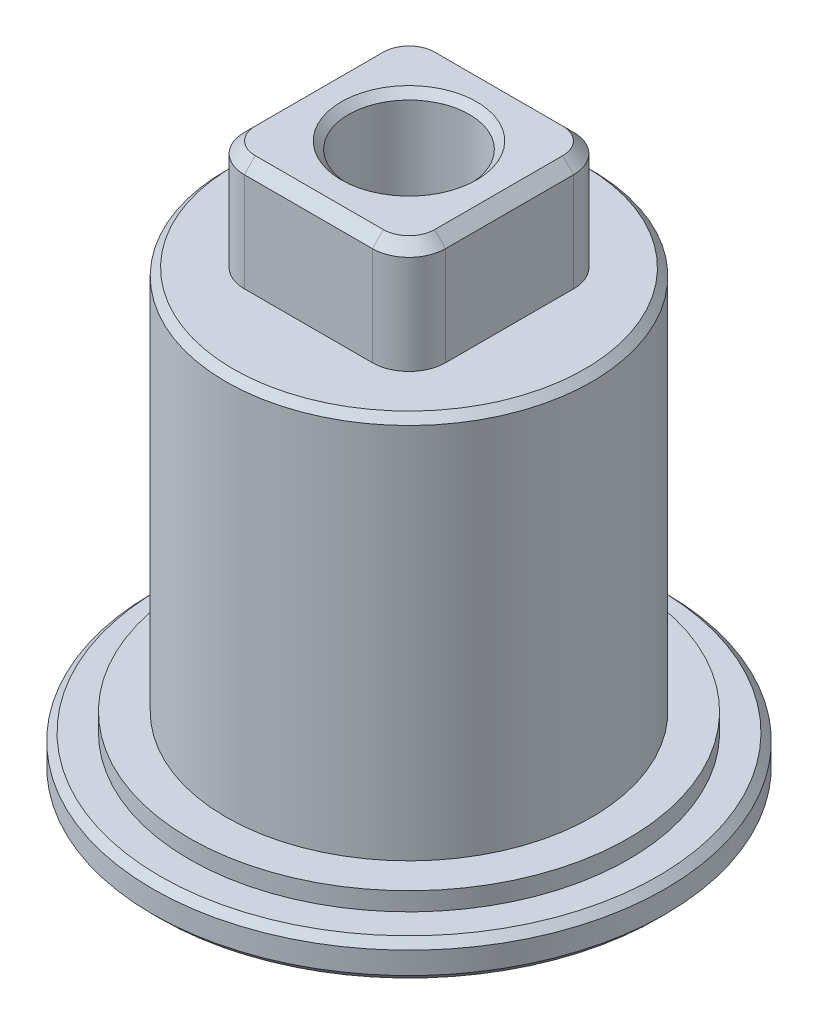
ISO-10303-21;
HEADER;
FILE_DESCRIPTION(('STEP AP214'),'2;1');
FILE_NAME('part.step','',(''),(''),'','','');
FILE_SCHEMA(('AUTOMOTIVE_DESIGN { 1 0 10303 214 1 1 1 1 }'));
ENDSEC;
DATA;
#1=APPLICATION_CONTEXT('core data for automotive mechanical design processes');
#2=APPLICATION_PROTOCOL_DEFINITION('international standard','automotive_design',2000,#1);
#3=PRODUCT_CONTEXT('',#1,'mechanical');
#4=PRODUCT('Part','Part','',(#3));
#5=PRODUCT_RELATED_PRODUCT_CATEGORY('part','',(#4));
#6=PRODUCT_DEFINITION_FORMATION('','',#4);
#7=PRODUCT_DEFINITION_CONTEXT('part definition',#1,'design');
#8=PRODUCT_DEFINITION('design','',#6,#7);
#9=PRODUCT_DEFINITION_SHAPE('','',#8);
#10=(LENGTH_UNIT() NAMED_UNIT(*) SI_UNIT(.MILLI.,.METRE.));
#11=(NAMED_UNIT(*) PLANE_ANGLE_UNIT() SI_UNIT($,.RADIAN.));
#12=(NAMED_UNIT(*) SI_UNIT($,.STERADIAN.) SOLID_ANGLE_UNIT());
#13=UNCERTAINTY_MEASURE_WITH_UNIT(LENGTH_MEASURE(1.E-05),#10,'distance_accuracy_value','');
#14=(GEOMETRIC_REPRESENTATION_CONTEXT(3) GLOBAL_UNCERTAINTY_ASSIGNED_CONTEXT((#13)) GLOBAL_UNIT_ASSIGNED_CONTEXT((#10,
#11,#12)) REPRESENTATION_CONTEXT('',''));
#15=CARTESIAN_POINT('',(0.,0.,0.));
#16=DIRECTION('',(0.,0.,1.));
#17=DIRECTION('',(1.,0.,0.));
#18=AXIS2_PLACEMENT_3D('',#15,#16,#17);
#19=CARTESIAN_POINT('',(0.,12.,0.));
#20=DIRECTION('',(0.,1.,0.));
#21=DIRECTION('',(0.,0.,1.));
#22=AXIS2_PLACEMENT_3D('',#19,#20,#21);
#23=PLANE('',#22);
#24=CARTESIAN_POINT('',(0.,12.,0.));
#25=DIRECTION('',(0.,1.,0.));
#26=DIRECTION('',(0.,0.,1.));
#27=AXIS2_PLACEMENT_3D('',#24,#25,#26);
#28=CIRCLE('',#27,4.80000000000001);
#29=CARTESIAN_POINT('',(0.,12.,4.80000000000001));
#30=VERTEX_POINT('',#29);
#31=EDGE_CURVE('E243',#30,#30,#28,.T.);
#32=ORIENTED_EDGE('',*,*,#31,.T.);
#33=EDGE_LOOP('',(#32));
#34=FACE_BOUND('',#33,.T.);
#35=DIRECTION('',(-1.,0.,0.));
#36=VECTOR('',#35,1.);
#37=CARTESIAN_POINT('',(0.,12.,-2.75));
#38=LINE('',#37,#36);
#39=CARTESIAN_POINT('',(1.75,12.,-2.75));
#40=VERTEX_POINT('',#39);
#41=CARTESIAN_POINT('',(-1.75,12.,-2.75));
#42=VERTEX_POINT('',#41);
#43=EDGE_CURVE('E354',#40,#42,#38,.T.);
#44=ORIENTED_EDGE('',*,*,#43,.F.);
#45=CARTESIAN_POINT('',(1.75,12.,-1.75));
#46=DIRECTION('',(0.,1.,0.));
#47=DIRECTION('',(0.,0.,1.));
#48=AXIS2_PLACEMENT_3D('',#45,#46,#47);
#49=CIRCLE('',#48,1.);
#50=CARTESIAN_POINT('',(2.75,12.,-1.75));
#51=VERTEX_POINT('',#50);
#52=EDGE_CURVE('E231',#40,#51,#49,.F.);
#53=ORIENTED_EDGE('',*,*,#52,.T.);
#54=DIRECTION('',(0.,0.,1.));
#55=VECTOR('',#54,1.);
#56=CARTESIAN_POINT('',(2.75,12.,0.));
#57=LINE('',#56,#55);
#58=CARTESIAN_POINT('',(2.75,12.,1.75));
#59=VERTEX_POINT('',#58);
#60=EDGE_CURVE('E356',#51,#59,#57,.T.);
#61=ORIENTED_EDGE('',*,*,#60,.T.);
#62=CARTESIAN_POINT('',(1.75,12.,1.75));
#63=DIRECTION('',(0.,1.,0.));
#64=DIRECTION('',(0.,0.,1.));
#65=AXIS2_PLACEMENT_3D('',#62,#63,#64);
#66=CIRCLE('',#65,1.);
#67=CARTESIAN_POINT('',(1.75,12.,2.75));
#68=VERTEX_POINT('',#67);
#69=EDGE_CURVE('E229',#59,#68,#66,.F.);
#70=ORIENTED_EDGE('',*,*,#69,.T.);
#71=DIRECTION('',(-1.,0.,0.));
#72=VECTOR('',#71,1.);
#73=CARTESIAN_POINT('',(0.,12.,2.75));
#74=LINE('',#73,#72);
#75=CARTESIAN_POINT('',(-1.75,12.,2.75));
#76=VERTEX_POINT('',#75);
#77=EDGE_CURVE('E201',#68,#76,#74,.T.);
#78=ORIENTED_EDGE('',*,*,#77,.T.);
#79=CARTESIAN_POINT('',(-1.75,12.,1.75));
#80=DIRECTION('',(0.,1.,0.));
#81=DIRECTION('',(0.,0.,1.));
#82=AXIS2_PLACEMENT_3D('',#79,#80,#81);
#83=CIRCLE('',#82,1.);
#84=CARTESIAN_POINT('',(-2.75,12.,1.75));
#85=VERTEX_POINT('',#84);
#86=EDGE_CURVE('E235',#76,#85,#83,.F.);
#87=ORIENTED_EDGE('',*,*,#86,.T.);
#88=DIRECTION('',(0.,0.,1.));
#89=VECTOR('',#88,1.);
#90=CARTESIAN_POINT('',(-2.75,12.,0.));
#91=LINE('',#90,#89);
#92=CARTESIAN_POINT('',(-2.75,12.,-1.75));
#93=VERTEX_POINT('',#92);
#94=EDGE_CURVE('E349',#93,#85,#91,.T.);
#95=ORIENTED_EDGE('',*,*,#94,.F.);
#96=CARTESIAN_POINT('',(-1.75,12.,-1.75));
#97=DIRECTION('',(0.,1.,0.));
#98=DIRECTION('',(0.,0.,1.));
#99=AXIS2_PLACEMENT_3D('',#96,#97,#98);
#100=CIRCLE('',#99,1.);
#101=EDGE_CURVE('E233',#93,#42,#100,.F.);
#102=ORIENTED_EDGE('',*,*,#101,.T.);
#103=EDGE_LOOP('',(#44,#53,#61,#70,#78,#87,#95,#102));
#104=FACE_BOUND('',#103,.T.);
#105=ADVANCED_FACE('F43',(#34,#104),#23,.T.);
#106=CARTESIAN_POINT('',(0.,1.5,0.));
#107=DIRECTION('',(0.,1.,0.));
#108=DIRECTION('',(0.,0.,1.));
#109=AXIS2_PLACEMENT_3D('',#106,#107,#108);
#110=PLANE('',#109);
#111=CARTESIAN_POINT('',(0.,1.5,0.));
#112=DIRECTION('',(0.,1.,0.));
#113=DIRECTION('',(0.,0.,1.));
#114=AXIS2_PLACEMENT_3D('',#111,#112,#113);
#115=CIRCLE('',#114,6.);
#116=CARTESIAN_POINT('',(0.,1.5,6.));
#117=VERTEX_POINT('',#116);
#118=EDGE_CURVE('E343',#117,#117,#115,.T.);
#119=ORIENTED_EDGE('',*,*,#118,.T.);
#120=EDGE_LOOP('',(#119));
#121=FACE_BOUND('',#120,.T.);
#122=CARTESIAN_POINT('',(0.,1.5,0.));
#123=DIRECTION('',(0.,1.,0.));
#124=DIRECTION('',(0.,0.,1.));
#125=AXIS2_PLACEMENT_3D('',#122,#123,#124);
#126=CIRCLE('',#125,5.);
#127=CARTESIAN_POINT('',(0.,1.5,5.));
#128=VERTEX_POINT('',#127);
#129=EDGE_CURVE('E337',#128,#128,#126,.F.);
#130=ORIENTED_EDGE('',*,*,#129,.T.);
#131=EDGE_LOOP('',(#130));
#132=FACE_BOUND('',#131,.T.);
#133=ADVANCED_FACE('F417',(#121,#132),#110,.T.);
#134=CARTESIAN_POINT('',(0.,1.,0.));
#135=DIRECTION('',(0.,1.,0.));
#136=DIRECTION('',(0.,0.,1.));
#137=AXIS2_PLACEMENT_3D('',#134,#135,#136);
#138=PLANE('',#137);
#139=CARTESIAN_POINT('',(0.,1.,0.));
#140=DIRECTION('',(0.,1.,0.));
#141=DIRECTION('',(0.,0.,1.));
#142=AXIS2_PLACEMENT_3D('',#139,#140,#141);
#143=CIRCLE('',#142,6.8);
#144=CARTESIAN_POINT('',(0.,1.,6.8));
#145=VERTEX_POINT('',#144);
#146=EDGE_CURVE('E249',#145,#145,#143,.T.);
#147=ORIENTED_EDGE('',*,*,#146,.T.);
#148=EDGE_LOOP('',(#147));
#149=FACE_BOUND('',#148,.T.);
#150=CARTESIAN_POINT('',(0.,1.,0.));
#151=DIRECTION('',(0.,1.,0.));
#152=DIRECTION('',(0.,0.,1.));
#153=AXIS2_PLACEMENT_3D('',#150,#151,#152);
#154=CIRCLE('',#153,6.);
#155=CARTESIAN_POINT('',(0.,1.,6.));
#156=VERTEX_POINT('',#155);
#157=EDGE_CURVE('E346',#156,#156,#154,.F.);
#158=ORIENTED_EDGE('',*,*,#157,.T.);
#159=EDGE_LOOP('',(#158));
#160=FACE_BOUND('',#159,.T.);
#161=ADVANCED_FACE('F423',(#149,#160),#138,.T.);
#162=CARTESIAN_POINT('',(0.,1.,0.));
#163=DIRECTION('',(0.,-1.,0.));
#164=DIRECTION('',(0.,0.,-1.));
#165=AXIS2_PLACEMENT_3D('',#162,#163,#164);
#166=CYLINDRICAL_SURFACE('',#165,7.);
#167=CARTESIAN_POINT('',(0.,0.799999999999994,0.));
#168=DIRECTION('',(0.,1.,0.));
#169=DIRECTION('',(0.,0.,1.));
#170=AXIS2_PLACEMENT_3D('',#167,#168,#169);
#171=CIRCLE('',#170,7.);
#172=CARTESIAN_POINT('',(0.,0.799999999999994,7.));
#173=VERTEX_POINT('',#172);
#174=EDGE_CURVE('E255',#173,#173,#171,.F.);
#175=ORIENTED_EDGE('',*,*,#174,.T.);
#176=EDGE_LOOP('',(#175));
#177=FACE_BOUND('',#176,.T.);
#178=CARTESIAN_POINT('',(0.,0.199999999999998,0.));
#179=DIRECTION('',(0.,1.,0.));
#180=DIRECTION('',(0.,0.,1.));
#181=AXIS2_PLACEMENT_3D('',#178,#179,#180);
#182=CIRCLE('',#181,7.);
#183=CARTESIAN_POINT('',(0.,0.199999999999998,7.));
#184=VERTEX_POINT('',#183);
#185=EDGE_CURVE('E252',#184,#184,#182,.T.);
#186=ORIENTED_EDGE('',*,*,#185,.T.);
#187=EDGE_LOOP('',(#186));
#188=FACE_BOUND('',#187,.T.);
#189=ADVANCED_FACE('F440',(#177,#188),#166,.T.);
#190=CARTESIAN_POINT('',(0.,1.,0.));
#191=DIRECTION('',(0.,-1.,0.));
#192=DIRECTION('',(0.,0.,-1.));
#193=AXIS2_PLACEMENT_3D('',#190,#191,#192);
#194=CYLINDRICAL_SURFACE('',#193,1.65);
#195=CARTESIAN_POINT('',(0.,14.8,0.));
#196=DIRECTION('',(0.,1.,0.));
#197=DIRECTION('',(0.,0.,1.));
#198=AXIS2_PLACEMENT_3D('',#195,#196,#197);
#199=CIRCLE('',#198,1.65);
#200=CARTESIAN_POINT('',(0.,14.8,1.65));
#201=VERTEX_POINT('',#200);
#202=EDGE_CURVE('E237',#201,#201,#199,.T.);
#203=ORIENTED_EDGE('',*,*,#202,.T.);
#204=EDGE_LOOP('',(#203));
#205=FACE_BOUND('',#204,.T.);
#206=CARTESIAN_POINT('',(0.,2.,0.));
#207=DIRECTION('',(0.,1.,0.));
#208=DIRECTION('',(0.,0.,1.));
#209=AXIS2_PLACEMENT_3D('',#206,#207,#208);
#210=CIRCLE('',#209,1.65);
#211=CARTESIAN_POINT('',(1.,2.,1.31244047484067));
#212=VERTEX_POINT('',#211);
#213=CARTESIAN_POINT('',(1.,2.,-1.31244047484067));
#214=VERTEX_POINT('',#213);
#215=EDGE_CURVE('E177',#212,#214,#210,.T.);
#216=ORIENTED_EDGE('',*,*,#215,.F.);
#217=CARTESIAN_POINT('',(-1.,2.,1.31244047484067));
#218=VERTEX_POINT('',#217);
#219=EDGE_CURVE('E195',#218,#212,#210,.T.);
#220=ORIENTED_EDGE('',*,*,#219,.F.);
#221=CARTESIAN_POINT('',(-1.,2.,-1.31244047484067));
#222=VERTEX_POINT('',#221);
#223=EDGE_CURVE('E200',#222,#218,#210,.T.);
#224=ORIENTED_EDGE('',*,*,#223,.F.);
#225=EDGE_CURVE('E206',#214,#222,#210,.T.);
#226=ORIENTED_EDGE('',*,*,#225,.F.);
#227=EDGE_LOOP('',(#216,#220,#224,#226));
#228=FACE_BOUND('',#227,.T.);
#229=ADVANCED_FACE('F204',(#205,#228),#194,.F.);
#230=CARTESIAN_POINT('',(0.,0.,0.));
#231=DIRECTION('',(0.,1.,0.));
#232=DIRECTION('',(0.,0.,1.));
#233=AXIS2_PLACEMENT_3D('',#230,#231,#232);
#234=PLANE('',#233);
#235=CARTESIAN_POINT('',(0.,0.,0.));
#236=DIRECTION('',(0.,1.,0.));
#237=DIRECTION('',(0.,0.,1.));
#238=AXIS2_PLACEMENT_3D('',#235,#236,#237);
#239=CIRCLE('',#238,6.8);
#240=CARTESIAN_POINT('',(0.,0.,6.8));
#241=VERTEX_POINT('',#240);
#242=EDGE_CURVE('E258',#241,#241,#239,.F.);
#243=ORIENTED_EDGE('',*,*,#242,.T.);
#244=EDGE_LOOP('',(#243));
#245=FACE_BOUND('',#244,.T.);
#246=DIRECTION('',(0.,0.,1.));
#247=VECTOR('',#246,1.);
#248=CARTESIAN_POINT('',(1.,0.,0.));
#249=LINE('',#248,#247);
#250=CARTESIAN_POINT('',(1.,0.,-3.));
#251=VERTEX_POINT('',#250);
#252=CARTESIAN_POINT('',(1.,0.,3.));
#253=VERTEX_POINT('',#252);
#254=EDGE_CURVE('E319',#251,#253,#249,.T.);
#255=ORIENTED_EDGE('',*,*,#254,.F.);
#256=CARTESIAN_POINT('',(0.,0.,-3.));
#257=DIRECTION('',(0.,-1.,0.));
#258=DIRECTION('',(0.,0.,-1.));
#259=AXIS2_PLACEMENT_3D('',#256,#257,#258);
#260=CIRCLE('',#259,1.);
#261=CARTESIAN_POINT('',(-1.,0.,-3.));
#262=VERTEX_POINT('',#261);
#263=EDGE_CURVE('E314',#262,#251,#260,.T.);
#264=ORIENTED_EDGE('',*,*,#263,.F.);
#265=DIRECTION('',(0.,0.,1.));
#266=VECTOR('',#265,1.);
#267=CARTESIAN_POINT('',(-1.,0.,0.));
#268=LINE('',#267,#266);
#269=CARTESIAN_POINT('',(-1.,0.,3.));
#270=VERTEX_POINT('',#269);
#271=EDGE_CURVE('E332',#262,#270,#268,.T.);
#272=ORIENTED_EDGE('',*,*,#271,.T.);
#273=CARTESIAN_POINT('',(0.,0.,3.));
#274=DIRECTION('',(0.,-1.,0.));
#275=DIRECTION('',(0.,0.,-1.));
#276=AXIS2_PLACEMENT_3D('',#273,#274,#275);
#277=CIRCLE('',#276,1.);
#278=EDGE_CURVE('E324',#253,#270,#277,.T.);
#279=ORIENTED_EDGE('',*,*,#278,.F.);
#280=EDGE_LOOP('',(#255,#264,#272,#279));
#281=FACE_BOUND('',#280,.T.);
#282=ADVANCED_FACE('F436',(#245,#281),#234,.F.);
#283=CARTESIAN_POINT('',(0.,1.5,0.));
#284=DIRECTION('',(0.,-1.,0.));
#285=DIRECTION('',(0.,0.,-1.));
#286=AXIS2_PLACEMENT_3D('',#283,#284,#285);
#287=CYLINDRICAL_SURFACE('',#286,6.);
#288=ORIENTED_EDGE('',*,*,#157,.F.);
#289=EDGE_LOOP('',(#288));
#290=FACE_BOUND('',#289,.T.);
#291=ORIENTED_EDGE('',*,*,#118,.F.);
#292=EDGE_LOOP('',(#291));
#293=FACE_BOUND('',#292,.T.);
#294=ADVANCED_FACE('F431',(#290,#293),#287,.T.);
#295=CARTESIAN_POINT('',(0.,12.,0.));
#296=DIRECTION('',(0.,-1.,0.));
#297=DIRECTION('',(0.,0.,-1.));
#298=AXIS2_PLACEMENT_3D('',#295,#296,#297);
#299=CYLINDRICAL_SURFACE('',#298,5.);
#300=CARTESIAN_POINT('',(0.,11.8,0.));
#301=DIRECTION('',(0.,1.,0.));
#302=DIRECTION('',(0.,0.,1.));
#303=AXIS2_PLACEMENT_3D('',#300,#301,#302);
#304=CIRCLE('',#303,5.);
#305=CARTESIAN_POINT('',(0.,11.8,5.));
#306=VERTEX_POINT('',#305);
#307=EDGE_CURVE('E246',#306,#306,#304,.F.);
#308=ORIENTED_EDGE('',*,*,#307,.T.);
#309=EDGE_LOOP('',(#308));
#310=FACE_BOUND('',#309,.T.);
#311=ORIENTED_EDGE('',*,*,#129,.F.);
#312=EDGE_LOOP('',(#311));
#313=FACE_BOUND('',#312,.T.);
#314=ADVANCED_FACE('F429',(#310,#313),#299,.T.);
#315=CARTESIAN_POINT('',(0.,15.,2.75));
#316=DIRECTION('',(0.,0.,-1.));
#317=DIRECTION('',(-1.,0.,0.));
#318=AXIS2_PLACEMENT_3D('',#315,#316,#317);
#319=PLANE('',#318);
#320=DIRECTION('',(0.,-1.,0.));
#321=VECTOR('',#320,1.);
#322=CARTESIAN_POINT('',(1.75,15.,2.75));
#323=LINE('',#322,#321);
#324=CARTESIAN_POINT('',(1.75,14.7,2.75));
#325=VERTEX_POINT('',#324);
#326=EDGE_CURVE('E217',#68,#325,#323,.F.);
#327=ORIENTED_EDGE('',*,*,#326,.T.);
#328=DIRECTION('',(-1.,0.,0.));
#329=VECTOR('',#328,1.);
#330=CARTESIAN_POINT('',(-1.75,14.7,2.75));
#331=LINE('',#330,#329);
#332=CARTESIAN_POINT('',(-1.75,14.7,2.75));
#333=VERTEX_POINT('',#332);
#334=EDGE_CURVE('E281',#325,#333,#331,.T.);
#335=ORIENTED_EDGE('',*,*,#334,.T.);
#336=DIRECTION('',(0.,-1.,0.));
#337=VECTOR('',#336,1.);
#338=CARTESIAN_POINT('',(-1.75,12.,2.75));
#339=LINE('',#338,#337);
#340=EDGE_CURVE('E215',#333,#76,#339,.T.);
#341=ORIENTED_EDGE('',*,*,#340,.T.);
#342=ORIENTED_EDGE('',*,*,#77,.F.);
#343=EDGE_LOOP('',(#327,#335,#341,#342));
#344=FACE_BOUND('',#343,.T.);
#345=ADVANCED_FACE('F368',(#344),#319,.F.);
#346=CARTESIAN_POINT('',(2.75,15.,0.));
#347=DIRECTION('',(-1.,0.,0.));
#348=DIRECTION('',(0.,0.,1.));
#349=AXIS2_PLACEMENT_3D('',#346,#347,#348);
#350=PLANE('',#349);
#351=DIRECTION('',(0.,-1.,0.));
#352=VECTOR('',#351,1.);
#353=CARTESIAN_POINT('',(2.75,15.,-1.75));
#354=LINE('',#353,#352);
#355=CARTESIAN_POINT('',(2.75,14.7,-1.75));
#356=VERTEX_POINT('',#355);
#357=EDGE_CURVE('E207',#51,#356,#354,.F.);
#358=ORIENTED_EDGE('',*,*,#357,.T.);
#359=DIRECTION('',(0.,0.,1.));
#360=VECTOR('',#359,1.);
#361=CARTESIAN_POINT('',(2.75,14.7,1.75));
#362=LINE('',#361,#360);
#363=CARTESIAN_POINT('',(2.75,14.7,1.75));
#364=VERTEX_POINT('',#363);
#365=EDGE_CURVE('E278',#356,#364,#362,.T.);
#366=ORIENTED_EDGE('',*,*,#365,.T.);
#367=DIRECTION('',(0.,-1.,0.));
#368=VECTOR('',#367,1.);
#369=CARTESIAN_POINT('',(2.75,15.,1.75));
#370=LINE('',#369,#368);
#371=EDGE_CURVE('E209',#364,#59,#370,.T.);
#372=ORIENTED_EDGE('',*,*,#371,.T.);
#373=ORIENTED_EDGE('',*,*,#60,.F.);
#374=EDGE_LOOP('',(#358,#366,#372,#373));
#375=FACE_BOUND('',#374,.T.);
#376=ADVANCED_FACE('F383',(#375),#350,.F.);
#377=CARTESIAN_POINT('',(0.,15.,-2.75));
#378=DIRECTION('',(0.,0.,-1.));
#379=DIRECTION('',(-1.,0.,0.));
#380=AXIS2_PLACEMENT_3D('',#377,#378,#379);
#381=PLANE('',#380);
#382=DIRECTION('',(0.,-1.,0.));
#383=VECTOR('',#382,1.);
#384=CARTESIAN_POINT('',(-1.75,15.,-2.75));
#385=LINE('',#384,#383);
#386=CARTESIAN_POINT('',(-1.75,14.7,-2.75));
#387=VERTEX_POINT('',#386);
#388=EDGE_CURVE('E220',#42,#387,#385,.F.);
#389=ORIENTED_EDGE('',*,*,#388,.T.);
#390=DIRECTION('',(1.,0.,0.));
#391=VECTOR('',#390,1.);
#392=CARTESIAN_POINT('',(0.,14.7,-2.75));
#393=LINE('',#392,#391);
#394=CARTESIAN_POINT('',(1.75,14.7,-2.75));
#395=VERTEX_POINT('',#394);
#396=EDGE_CURVE('E58',#387,#395,#393,.T.);
#397=ORIENTED_EDGE('',*,*,#396,.T.);
#398=DIRECTION('',(0.,-1.,0.));
#399=VECTOR('',#398,1.);
#400=CARTESIAN_POINT('',(1.75,12.,-2.75));
#401=LINE('',#400,#399);
#402=EDGE_CURVE('E222',#395,#40,#401,.T.);
#403=ORIENTED_EDGE('',*,*,#402,.T.);
#404=ORIENTED_EDGE('',*,*,#43,.T.);
#405=EDGE_LOOP('',(#389,#397,#403,#404));
#406=FACE_BOUND('',#405,.T.);
#407=ADVANCED_FACE('F756',(#406),#381,.T.);
#408=CARTESIAN_POINT('',(-2.75,15.,0.));
#409=DIRECTION('',(-1.,0.,0.));
#410=DIRECTION('',(0.,0.,1.));
#411=AXIS2_PLACEMENT_3D('',#408,#409,#410);
#412=PLANE('',#411);
#413=DIRECTION('',(0.,-1.,0.));
#414=VECTOR('',#413,1.);
#415=CARTESIAN_POINT('',(-2.75,15.,1.75));
#416=LINE('',#415,#414);
#417=CARTESIAN_POINT('',(-2.75,14.7,1.75));
#418=VERTEX_POINT('',#417);
#419=EDGE_CURVE('E224',#85,#418,#416,.F.);
#420=ORIENTED_EDGE('',*,*,#419,.T.);
#421=DIRECTION('',(0.,0.,-1.));
#422=VECTOR('',#421,1.);
#423=CARTESIAN_POINT('',(-2.75,14.7,0.));
#424=LINE('',#423,#422);
#425=CARTESIAN_POINT('',(-2.75,14.7,-1.75));
#426=VERTEX_POINT('',#425);
#427=EDGE_CURVE('E283',#418,#426,#424,.T.);
#428=ORIENTED_EDGE('',*,*,#427,.T.);
#429=DIRECTION('',(0.,-1.,0.));
#430=VECTOR('',#429,1.);
#431=CARTESIAN_POINT('',(-2.75,15.,-1.75));
#432=LINE('',#431,#430);
#433=EDGE_CURVE('E227',#426,#93,#432,.T.);
#434=ORIENTED_EDGE('',*,*,#433,.T.);
#435=ORIENTED_EDGE('',*,*,#94,.T.);
#436=EDGE_LOOP('',(#420,#428,#434,#435));
#437=FACE_BOUND('',#436,.T.);
#438=ADVANCED_FACE('F762',(#437),#412,.T.);
#439=CARTESIAN_POINT('',(0.,15.,0.));
#440=DIRECTION('',(0.,1.,0.));
#441=DIRECTION('',(0.,0.,1.));
#442=AXIS2_PLACEMENT_3D('',#439,#440,#441);
#443=PLANE('',#442);
#444=CARTESIAN_POINT('',(-1.75,15.,1.75));
#445=DIRECTION('',(0.,1.,0.));
#446=DIRECTION('',(0.,0.,1.));
#447=AXIS2_PLACEMENT_3D('',#444,#445,#446);
#448=CIRCLE('',#447,0.700000000000002);
#449=CARTESIAN_POINT('',(-2.45000000000001,15.,1.75));
#450=VERTEX_POINT('',#449);
#451=CARTESIAN_POINT('',(-1.75,15.,2.45));
#452=VERTEX_POINT('',#451);
#453=EDGE_CURVE('E274',#450,#452,#448,.T.);
#454=ORIENTED_EDGE('',*,*,#453,.T.);
#455=DIRECTION('',(1.,0.,0.));
#456=VECTOR('',#455,1.);
#457=CARTESIAN_POINT('',(1.75,15.,2.45));
#458=LINE('',#457,#456);
#459=CARTESIAN_POINT('',(1.75,15.,2.45));
#460=VERTEX_POINT('',#459);
#461=EDGE_CURVE('E276',#452,#460,#458,.T.);
#462=ORIENTED_EDGE('',*,*,#461,.T.);
#463=CARTESIAN_POINT('',(1.75,15.,1.75));
#464=DIRECTION('',(0.,1.,0.));
#465=DIRECTION('',(0.,0.,1.));
#466=AXIS2_PLACEMENT_3D('',#463,#464,#465);
#467=CIRCLE('',#466,0.700000000000002);
#468=CARTESIAN_POINT('',(2.45,15.,1.75));
#469=VERTEX_POINT('',#468);
#470=EDGE_CURVE('E272',#460,#469,#467,.T.);
#471=ORIENTED_EDGE('',*,*,#470,.T.);
#472=DIRECTION('',(0.,0.,-1.));
#473=VECTOR('',#472,1.);
#474=CARTESIAN_POINT('',(2.45,15.,-1.75));
#475=LINE('',#474,#473);
#476=CARTESIAN_POINT('',(2.45,15.,-1.75));
#477=VERTEX_POINT('',#476);
#478=EDGE_CURVE('E269',#469,#477,#475,.T.);
#479=ORIENTED_EDGE('',*,*,#478,.T.);
#480=CARTESIAN_POINT('',(1.75,15.,-1.75));
#481=DIRECTION('',(0.,1.,0.));
#482=DIRECTION('',(0.,0.,1.));
#483=AXIS2_PLACEMENT_3D('',#480,#481,#482);
#484=CIRCLE('',#483,0.700000000000002);
#485=CARTESIAN_POINT('',(1.75,15.,-2.45));
#486=VERTEX_POINT('',#485);
#487=EDGE_CURVE('E263',#477,#486,#484,.T.);
#488=ORIENTED_EDGE('',*,*,#487,.T.);
#489=DIRECTION('',(-1.,0.,0.));
#490=VECTOR('',#489,1.);
#491=CARTESIAN_POINT('',(0.,15.,-2.45));
#492=LINE('',#491,#490);
#493=CARTESIAN_POINT('',(-1.75,15.,-2.45));
#494=VERTEX_POINT('',#493);
#495=EDGE_CURVE('E261',#486,#494,#492,.T.);
#496=ORIENTED_EDGE('',*,*,#495,.T.);
#497=CARTESIAN_POINT('',(-1.75,15.,-1.75));
#498=DIRECTION('',(0.,1.,0.));
#499=DIRECTION('',(0.,0.,1.));
#500=AXIS2_PLACEMENT_3D('',#497,#498,#499);
#501=CIRCLE('',#500,0.700000000000002);
#502=CARTESIAN_POINT('',(-2.45,15.,-1.75));
#503=VERTEX_POINT('',#502);
#504=EDGE_CURVE('E265',#494,#503,#501,.T.);
#505=ORIENTED_EDGE('',*,*,#504,.T.);
#506=DIRECTION('',(0.,0.,1.));
#507=VECTOR('',#506,1.);
#508=CARTESIAN_POINT('',(-2.45000000000001,15.,0.));
#509=LINE('',#508,#507);
#510=EDGE_CURVE('E267',#503,#450,#509,.T.);
#511=ORIENTED_EDGE('',*,*,#510,.T.);
#512=EDGE_LOOP('',(#454,#462,#471,#479,#488,#496,#505,#511));
#513=FACE_BOUND('',#512,.T.);
#514=CARTESIAN_POINT('',(0.,15.,0.));
#515=DIRECTION('',(0.,1.,0.));
#516=DIRECTION('',(0.,0.,1.));
#517=AXIS2_PLACEMENT_3D('',#514,#515,#516);
#518=CIRCLE('',#517,1.85);
#519=CARTESIAN_POINT('',(0.,15.,1.85));
#520=VERTEX_POINT('',#519);
#521=EDGE_CURVE('E240',#520,#520,#518,.F.);
#522=ORIENTED_EDGE('',*,*,#521,.T.);
#523=EDGE_LOOP('',(#522));
#524=FACE_BOUND('',#523,.T.);
#525=ADVANCED_FACE('F395',(#513,#524),#443,.T.);
#526=CARTESIAN_POINT('',(0.,2.,0.));
#527=DIRECTION('',(0.,-1.,0.));
#528=DIRECTION('',(0.,0.,-1.));
#529=AXIS2_PLACEMENT_3D('',#526,#527,#528);
#530=PLANE('',#529);
#531=ORIENTED_EDGE('',*,*,#225,.T.);
#532=DIRECTION('',(0.,0.,1.));
#533=VECTOR('',#532,1.);
#534=CARTESIAN_POINT('',(-1.,2.,0.));
#535=LINE('',#534,#533);
#536=CARTESIAN_POINT('',(-1.,2.,-3.));
#537=VERTEX_POINT('',#536);
#538=EDGE_CURVE('E327',#537,#222,#535,.T.);
#539=ORIENTED_EDGE('',*,*,#538,.F.);
#540=CARTESIAN_POINT('',(0.,2.,-3.));
#541=DIRECTION('',(0.,-1.,0.));
#542=DIRECTION('',(0.,0.,-1.));
#543=AXIS2_PLACEMENT_3D('',#540,#541,#542);
#544=CIRCLE('',#543,1.);
#545=CARTESIAN_POINT('',(1.,2.,-3.));
#546=VERTEX_POINT('',#545);
#547=EDGE_CURVE('E191',#537,#546,#544,.T.);
#548=ORIENTED_EDGE('',*,*,#547,.T.);
#549=DIRECTION('',(0.,0.,1.));
#550=VECTOR('',#549,1.);
#551=CARTESIAN_POINT('',(1.,2.,0.));
#552=LINE('',#551,#550);
#553=EDGE_CURVE('E190',#546,#214,#552,.T.);
#554=ORIENTED_EDGE('',*,*,#553,.T.);
#555=EDGE_LOOP('',(#531,#539,#548,#554));
#556=FACE_BOUND('',#555,.T.);
#557=ADVANCED_FACE('F711',(#556),#530,.T.);
#558=ORIENTED_EDGE('',*,*,#219,.T.);
#559=CARTESIAN_POINT('',(1.,2.,3.));
#560=VERTEX_POINT('',#559);
#561=EDGE_CURVE('E182',#212,#560,#552,.T.);
#562=ORIENTED_EDGE('',*,*,#561,.T.);
#563=CARTESIAN_POINT('',(0.,2.,3.));
#564=DIRECTION('',(0.,-1.,0.));
#565=DIRECTION('',(0.,0.,-1.));
#566=AXIS2_PLACEMENT_3D('',#563,#564,#565);
#567=CIRCLE('',#566,1.);
#568=CARTESIAN_POINT('',(-1.,2.,3.));
#569=VERTEX_POINT('',#568);
#570=EDGE_CURVE('E880',#560,#569,#567,.T.);
#571=ORIENTED_EDGE('',*,*,#570,.T.);
#572=EDGE_CURVE('E197',#218,#569,#535,.T.);
#573=ORIENTED_EDGE('',*,*,#572,.F.);
#574=EDGE_LOOP('',(#558,#562,#571,#573));
#575=FACE_BOUND('',#574,.T.);
#576=ADVANCED_FACE('F196',(#575),#530,.T.);
#577=CARTESIAN_POINT('',(0.,2.,-3.));
#578=DIRECTION('',(0.,-1.,0.));
#579=DIRECTION('',(0.,0.,-1.));
#580=AXIS2_PLACEMENT_3D('',#577,#578,#579);
#581=CYLINDRICAL_SURFACE('',#580,1.);
#582=ORIENTED_EDGE('',*,*,#263,.T.);
#583=DIRECTION('',(0.,-1.,0.));
#584=VECTOR('',#583,1.);
#585=CARTESIAN_POINT('',(1.,2.,-3.));
#586=LINE('',#585,#584);
#587=EDGE_CURVE('E341',#546,#251,#586,.T.);
#588=ORIENTED_EDGE('',*,*,#587,.F.);
#589=ORIENTED_EDGE('',*,*,#547,.F.);
#590=DIRECTION('',(0.,-1.,0.));
#591=VECTOR('',#590,1.);
#592=CARTESIAN_POINT('',(-1.,2.,-3.));
#593=LINE('',#592,#591);
#594=EDGE_CURVE('E335',#537,#262,#593,.T.);
#595=ORIENTED_EDGE('',*,*,#594,.T.);
#596=EDGE_LOOP('',(#582,#588,#589,#595));
#597=FACE_BOUND('',#596,.T.);
#598=ADVANCED_FACE('F691',(#597),#581,.F.);
#599=CARTESIAN_POINT('',(-1.,2.,0.));
#600=DIRECTION('',(1.,0.,0.));
#601=DIRECTION('',(0.,0.,-1.));
#602=AXIS2_PLACEMENT_3D('',#599,#600,#601);
#603=PLANE('',#602);
#604=CARTESIAN_POINT('',(-1.,3.43684841009068,5.02023073470829));
#605=CARTESIAN_POINT('',(-1.,3.3764677213073,4.87158273692043));
#606=CARTESIAN_POINT('',(-1.,3.316166733192,4.7229022272814));
#607=CARTESIAN_POINT('',(-1.,3.195794288905,4.42544087612442));
#608=CARTESIAN_POINT('',(-1.,3.13572284275206,4.27666003055317));
#609=CARTESIAN_POINT('',(-1.,3.01580466050986,3.97877636111956));
#610=CARTESIAN_POINT('',(-1.,2.95595833265988,3.82967337281111));
#611=CARTESIAN_POINT('',(-1.,2.83669261976826,3.5313032789513));
#612=CARTESIAN_POINT('',(-1.,2.7772732181813,3.38203618002129));
#613=CARTESIAN_POINT('',(-1.,2.65144006273335,3.06404719992804));
#614=CARTESIAN_POINT('',(-1.,2.5851096459932,2.89529231583766));
#615=CARTESIAN_POINT('',(-1.,2.45365731399706,2.55728526000597));
#616=CARTESIAN_POINT('',(-1.,2.38853555163838,2.38803302844406));
#617=CARTESIAN_POINT('',(-1.,2.29246563047313,2.13360610322543));
#618=CARTESIAN_POINT('',(-1.,2.260720899428,2.04873263839004));
#619=CARTESIAN_POINT('',(-1.,2.19796397958191,1.87871575312164));
#620=CARTESIAN_POINT('',(-1.,2.16695178064244,1.79357233644338));
#621=CARTESIAN_POINT('',(-1.,2.10595476931826,1.62293618680902));
#622=CARTESIAN_POINT('',(-1.,2.07596975481602,1.53744352632183));
#623=CARTESIAN_POINT('',(-1.,2.01747020005909,1.36595837213323));
#624=CARTESIAN_POINT('',(-1.,1.98895555380104,1.27996591496243));
#625=CARTESIAN_POINT('',(-1.,1.94520775608869,1.14217145153408));
#626=CARTESIAN_POINT('',(-1.,1.92926402646094,1.09059582316944));
#627=CARTESIAN_POINT('',(-1.,1.89838945552433,0.987140219132623));
#628=CARTESIAN_POINT('',(-1.,1.88345863136176,0.935260238324553));
#629=CARTESIAN_POINT('',(-1.,1.85490128255331,0.831110280584339));
#630=CARTESIAN_POINT('',(-1.,1.84127537608438,0.778840131333508));
#631=CARTESIAN_POINT('',(-1.,1.81572592197976,0.67389090145698));
#632=CARTESIAN_POINT('',(-1.,1.80380240229002,0.621211814133224));
#633=CARTESIAN_POINT('',(-1.,1.77193679244856,0.465461766507077));
#634=CARTESIAN_POINT('',(-1.,1.75503165030073,0.361700808851395));
#635=CARTESIAN_POINT('',(-1.,1.73887374836793,0.205202722207416));
#636=CARTESIAN_POINT('',(-1.,1.7350204999622,0.152935880873584));
#637=CARTESIAN_POINT('',(-1.,1.73068312392119,0.0482597166682834));
#638=CARTESIAN_POINT('',(-1.,1.73019874650865,-0.00414959535177998));
#639=CARTESIAN_POINT('',(-1.,1.73265574200803,-0.109316946697184));
#640=CARTESIAN_POINT('',(-1.,1.73562533284984,-0.162074307530857));
#641=CARTESIAN_POINT('',(-1.,1.74477394122409,-0.267307119478994));
#642=CARTESIAN_POINT('',(-1.,1.7509533628803,-0.319782534255208));
#643=CARTESIAN_POINT('',(-1.,1.77362732882252,-0.476813847346225));
#644=CARTESIAN_POINT('',(-1.,1.79424965348873,-0.580771487605967));
#645=CARTESIAN_POINT('',(-1.,1.83076526465908,-0.736928529194529));
#646=CARTESIAN_POINT('',(-1.,1.84410250252674,-0.78978127015658));
#647=CARTESIAN_POINT('',(-1.,1.87221115578352,-0.895109136255428));
#648=CARTESIAN_POINT('',(-1.,1.88698255378403,-0.947584265962327));
#649=CARTESIAN_POINT('',(-1.,1.91761066933039,-1.05216001474489));
#650=CARTESIAN_POINT('',(-1.,1.93346638050238,-1.10426093279945));
#651=CARTESIAN_POINT('',(-1.,1.96602891774368,-1.20819475472224));
#652=CARTESIAN_POINT('',(-1.,1.98273573347451,-1.26002766183761));
#653=CARTESIAN_POINT('',(-1.,2.02714676572503,-1.39485597558358));
#654=CARTESIAN_POINT('',(-1.,2.05537358069811,-1.47767876700112));
#655=CARTESIAN_POINT('',(-1.,2.11300239276768,-1.64291561950859));
#656=CARTESIAN_POINT('',(-1.,2.14240444348078,-1.72532966175733));
#657=CARTESIAN_POINT('',(-1.,2.23184919777346,-1.97214547572995));
#658=CARTESIAN_POINT('',(-1.,2.29312331891309,-2.13609980208336));
#659=CARTESIAN_POINT('',(-1.,2.41748447347474,-2.46344709288972));
#660=CARTESIAN_POINT('',(-1.,2.48057277804932,-2.62683956926818));
#661=CARTESIAN_POINT('',(-1.,2.60782465110226,-2.95318949215403));
#662=CARTESIAN_POINT('',(-1.,2.67198813069468,-3.1161469733443));
#663=CARTESIAN_POINT('',(-1.,2.79414311102177,-3.42445909564205));
#664=CARTESIAN_POINT('',(-1.,2.85206476201245,-3.56984148754941));
#665=CARTESIAN_POINT('',(-1.,2.96830279370635,-3.86045262093053));
#666=CARTESIAN_POINT('',(-1.,3.02661918439286,-4.00568135841002));
#667=CARTESIAN_POINT('',(-1.,3.14346684186039,-4.29584825709221));
#668=CARTESIAN_POINT('',(-1.,3.20199776366695,-4.44078655733216));
#669=CARTESIAN_POINT('',(-1.,3.31927653331528,-4.73057050011873));
#670=CARTESIAN_POINT('',(-1.,3.37802437482419,-4.87541614522777));
#671=CARTESIAN_POINT('',(-1.,3.43684841009068,-5.02023073470829));
#672=B_SPLINE_CURVE_WITH_KNOTS('',3,(#604,#605,#606,#607,#608,#609,#610,#611,#612,#613,#614,
#615,#616,#617,#618,#619,#620,#621,#622,#623,#624,#625,#626,#627,#628,#629,#630,#631,#632,#633,
#634,#635,#636,#637,#638,#639,#640,#641,#642,#643,#644,#645,#646,#647,#648,#649,#650,#651,#652,
#653,#654,#655,#656,#657,#658,#659,#660,#661,#662,#663,#664,#665,#666,#667,#668,#669,#670,#671),
.UNSPECIFIED.,.F.,.F.,(4,2,2,2,2,2,2,2,2,2,2,2,2,2,2,2,2,2,2,2,2,2,2,2,2,2,2,2,2,2,2,2,2,4),(0.,
0.481330093188776,0.962680960227362,1.44467591802442,1.92665209447426,2.47061826466175,
3.01465278503236,3.28649808068238,3.5583396116907,3.83012734196339,4.10189545075053,
4.26383864046503,4.42578457084484,4.58780684404464,4.74983177665479,5.06459561532535,
5.22172747009286,5.37884767455311,5.53726057546193,5.69569342569021,6.01316611321636,
6.17669061736064,6.3402131390827,6.50358589958774,6.66695667605701,6.92944447045774,
7.19194425377404,7.71701076718624,8.24245460401469,8.76785521404336,9.23734223889463,
9.7068411821529,10.1757725680511,10.6446903702529),.UNSPECIFIED.);
#673=EDGE_CURVE('E296',#218,#222,#672,.T.);
#674=ORIENTED_EDGE('',*,*,#673,.F.);
#675=ORIENTED_EDGE('',*,*,#572,.T.);
#676=DIRECTION('',(0.,-1.,0.));
#677=VECTOR('',#676,1.);
#678=CARTESIAN_POINT('',(-1.,2.,3.));
#679=LINE('',#678,#677);
#680=EDGE_CURVE('E338',#569,#270,#679,.T.);
#681=ORIENTED_EDGE('',*,*,#680,.T.);
#682=ORIENTED_EDGE('',*,*,#271,.F.);
#683=ORIENTED_EDGE('',*,*,#594,.F.);
#684=ORIENTED_EDGE('',*,*,#538,.T.);
#685=EDGE_LOOP('',(#674,#675,#681,#682,#683,#684));
#686=FACE_BOUND('',#685,.T.);
#687=ADVANCED_FACE('F680',(#686),#603,.T.);
#688=CARTESIAN_POINT('',(0.,2.,3.));
#689=DIRECTION('',(0.,-1.,0.));
#690=DIRECTION('',(0.,0.,-1.));
#691=AXIS2_PLACEMENT_3D('',#688,#689,#690);
#692=CYLINDRICAL_SURFACE('',#691,1.);
#693=ORIENTED_EDGE('',*,*,#278,.T.);
#694=ORIENTED_EDGE('',*,*,#680,.F.);
#695=ORIENTED_EDGE('',*,*,#570,.F.);
#696=DIRECTION('',(0.,-1.,0.));
#697=VECTOR('',#696,1.);
#698=CARTESIAN_POINT('',(1.,2.,3.));
#699=LINE('',#698,#697);
#700=EDGE_CURVE('E186',#560,#253,#699,.T.);
#701=ORIENTED_EDGE('',*,*,#700,.T.);
#702=EDGE_LOOP('',(#693,#694,#695,#701));
#703=FACE_BOUND('',#702,.T.);
#704=ADVANCED_FACE('F670',(#703),#692,.F.);
#705=CARTESIAN_POINT('',(1.,2.,0.));
#706=DIRECTION('',(1.,0.,0.));
#707=DIRECTION('',(0.,0.,-1.));
#708=AXIS2_PLACEMENT_3D('',#705,#706,#707);
#709=PLANE('',#708);
#710=ORIENTED_EDGE('',*,*,#561,.F.);
#711=CARTESIAN_POINT('',(1.,3.43684841009068,5.02023073470829));
#712=CARTESIAN_POINT('',(1.,3.3764677213073,4.87158273692042));
#713=CARTESIAN_POINT('',(1.,3.316166733192,4.7229022272814));
#714=CARTESIAN_POINT('',(1.,3.195794288905,4.42544087612442));
#715=CARTESIAN_POINT('',(1.,3.13572284275206,4.27666003055317));
#716=CARTESIAN_POINT('',(1.,3.01580466050986,3.97877636111955));
#717=CARTESIAN_POINT('',(1.,2.95595833265988,3.82967337281111));
#718=CARTESIAN_POINT('',(1.,2.83669261976826,3.5313032789513));
#719=CARTESIAN_POINT('',(1.,2.7772732181813,3.38203618002129));
#720=CARTESIAN_POINT('',(1.,2.65144006273335,3.06404719992804));
#721=CARTESIAN_POINT('',(1.,2.5851096459932,2.89529231583766));
#722=CARTESIAN_POINT('',(1.,2.45365731399706,2.55728526000597));
#723=CARTESIAN_POINT('',(1.,2.38853555163838,2.38803302844406));
#724=CARTESIAN_POINT('',(1.,2.29246563047313,2.13360610322543));
#725=CARTESIAN_POINT('',(1.,2.260720899428,2.04873263839004));
#726=CARTESIAN_POINT('',(1.,2.19796397958191,1.87871575312164));
#727=CARTESIAN_POINT('',(1.,2.16695178064244,1.79357233644338));
#728=CARTESIAN_POINT('',(1.,2.10595476931826,1.62293618680902));
#729=CARTESIAN_POINT('',(1.,2.07596975481602,1.53744352632183));
#730=CARTESIAN_POINT('',(1.,2.01747020005909,1.36595837213323));
#731=CARTESIAN_POINT('',(1.,1.98895555380104,1.27996591496243));
#732=CARTESIAN_POINT('',(1.,1.94520775608869,1.14217145153408));
#733=CARTESIAN_POINT('',(1.,1.92926402646094,1.09059582316944));
#734=CARTESIAN_POINT('',(1.,1.89838945552433,0.987140219132623));
#735=CARTESIAN_POINT('',(1.,1.88345863136176,0.935260238324553));
#736=CARTESIAN_POINT('',(1.,1.85490128255331,0.831110280584339));
#737=CARTESIAN_POINT('',(1.,1.84127537608438,0.778840131333508));
#738=CARTESIAN_POINT('',(1.,1.81572592197976,0.67389090145698));
#739=CARTESIAN_POINT('',(1.,1.80380240229002,0.621211814133224));
#740=CARTESIAN_POINT('',(1.,1.77193679244856,0.465461766507077));
#741=CARTESIAN_POINT('',(1.,1.75503165030073,0.361700808851395));
#742=CARTESIAN_POINT('',(1.,1.73887374836793,0.205202722207415));
#743=CARTESIAN_POINT('',(1.,1.7350204999622,0.152935880873584));
#744=CARTESIAN_POINT('',(1.,1.73068312392119,0.048259716668283));
#745=CARTESIAN_POINT('',(1.,1.73019874650865,-0.00414959535178045));
#746=CARTESIAN_POINT('',(1.,1.73265574200803,-0.109316946697184));
#747=CARTESIAN_POINT('',(1.,1.73562533284984,-0.162074307530857));
#748=CARTESIAN_POINT('',(1.,1.74477394122409,-0.267307119478994));
#749=CARTESIAN_POINT('',(1.,1.7509533628803,-0.319782534255208));
#750=CARTESIAN_POINT('',(1.,1.77362732882252,-0.476813847346225));
#751=CARTESIAN_POINT('',(1.,1.79424965348873,-0.580771487605967));
#752=CARTESIAN_POINT('',(1.,1.83076526465908,-0.736928529194529));
#753=CARTESIAN_POINT('',(1.,1.84410250252674,-0.789781270156581));
#754=CARTESIAN_POINT('',(1.,1.87221115578352,-0.895109136255428));
#755=CARTESIAN_POINT('',(1.,1.88698255378403,-0.947584265962328));
#756=CARTESIAN_POINT('',(1.,1.91761066933039,-1.05216001474489));
#757=CARTESIAN_POINT('',(1.,1.93346638050238,-1.10426093279945));
#758=CARTESIAN_POINT('',(1.,1.96602891774368,-1.20819475472224));
#759=CARTESIAN_POINT('',(1.,1.98273573347451,-1.26002766183761));
#760=CARTESIAN_POINT('',(1.,2.02714676572503,-1.39485597558358));
#761=CARTESIAN_POINT('',(1.,2.05537358069811,-1.47767876700112));
#762=CARTESIAN_POINT('',(1.,2.11300239276768,-1.64291561950859));
#763=CARTESIAN_POINT('',(1.,2.14240444348078,-1.72532966175733));
#764=CARTESIAN_POINT('',(1.,2.23184919777346,-1.97214547572995));
#765=CARTESIAN_POINT('',(1.,2.29312331891309,-2.13609980208336));
#766=CARTESIAN_POINT('',(1.,2.41748447347474,-2.46344709288973));
#767=CARTESIAN_POINT('',(1.,2.48057277804932,-2.62683956926818));
#768=CARTESIAN_POINT('',(1.,2.60782465110226,-2.95318949215403));
#769=CARTESIAN_POINT('',(1.,2.67198813069468,-3.1161469733443));
#770=CARTESIAN_POINT('',(1.,2.79414311102177,-3.42445909564205));
#771=CARTESIAN_POINT('',(1.,2.85206476201245,-3.56984148754941));
#772=CARTESIAN_POINT('',(1.,2.96830279370635,-3.86045262093053));
#773=CARTESIAN_POINT('',(1.,3.02661918439286,-4.00568135841002));
#774=CARTESIAN_POINT('',(1.,3.14346684186039,-4.29584825709221));
#775=CARTESIAN_POINT('',(1.,3.20199776366694,-4.44078655733216));
#776=CARTESIAN_POINT('',(1.,3.31927653331528,-4.73057050011873));
#777=CARTESIAN_POINT('',(1.,3.37802437482419,-4.87541614522777));
#778=CARTESIAN_POINT('',(1.,3.43684841009068,-5.02023073470829));
#779=B_SPLINE_CURVE_WITH_KNOTS('',3,(#711,#712,#713,#714,#715,#716,#717,#718,#719,#720,#721,
#722,#723,#724,#725,#726,#727,#728,#729,#730,#731,#732,#733,#734,#735,#736,#737,#738,#739,#740,
#741,#742,#743,#744,#745,#746,#747,#748,#749,#750,#751,#752,#753,#754,#755,#756,#757,#758,#759,
#760,#761,#762,#763,#764,#765,#766,#767,#768,#769,#770,#771,#772,#773,#774,#775,#776,#777,#778),
.UNSPECIFIED.,.F.,.F.,(4,2,2,2,2,2,2,2,2,2,2,2,2,2,2,2,2,2,2,2,2,2,2,2,2,2,2,2,2,2,2,2,2,4),(0.,
0.481330093188777,0.962680960227363,1.44467591802443,1.92665209447426,2.47061826466175,
3.01465278503236,3.28649808068239,3.5583396116907,3.83012734196339,4.10189545075053,
4.26383864046503,4.42578457084484,4.58780684404464,4.74983177665479,5.06459561532535,
5.22172747009286,5.37884767455311,5.53726057546193,5.6956934256902,6.01316611321636,
6.17669061736063,6.3402131390827,6.50358589958774,6.66695667605701,6.92944447045773,
7.19194425377404,7.71701076718624,8.24245460401469,8.76785521404335,9.23734223889463,
9.7068411821529,10.1757725680511,10.6446903702529),.UNSPECIFIED.);
#780=EDGE_CURVE('E11',#212,#214,#779,.T.);
#781=ORIENTED_EDGE('',*,*,#780,.T.);
#782=ORIENTED_EDGE('',*,*,#553,.F.);
#783=ORIENTED_EDGE('',*,*,#587,.T.);
#784=ORIENTED_EDGE('',*,*,#254,.T.);
#785=ORIENTED_EDGE('',*,*,#700,.F.);
#786=EDGE_LOOP('',(#710,#781,#782,#783,#784,#785));
#787=FACE_BOUND('',#786,.T.);
#788=ADVANCED_FACE('F184',(#787),#709,.F.);
#789=CARTESIAN_POINT('',(1.75,15.,1.75));
#790=DIRECTION('',(0.,-1.,0.));
#791=DIRECTION('',(0.,0.,-1.));
#792=AXIS2_PLACEMENT_3D('',#789,#790,#791);
#793=CYLINDRICAL_SURFACE('',#792,1.);
#794=ORIENTED_EDGE('',*,*,#371,.F.);
#795=CARTESIAN_POINT('',(1.75,14.7,1.75));
#796=DIRECTION('',(0.,1.,0.));
#797=DIRECTION('',(0.,0.,1.));
#798=AXIS2_PLACEMENT_3D('',#795,#796,#797);
#799=CIRCLE('',#798,1.);
#800=EDGE_CURVE('E287',#364,#325,#799,.F.);
#801=ORIENTED_EDGE('',*,*,#800,.T.);
#802=ORIENTED_EDGE('',*,*,#326,.F.);
#803=ORIENTED_EDGE('',*,*,#69,.F.);
#804=EDGE_LOOP('',(#794,#801,#802,#803));
#805=FACE_BOUND('',#804,.T.);
#806=ADVANCED_FACE('F373',(#805),#793,.T.);
#807=CARTESIAN_POINT('',(1.75,15.,-1.75));
#808=DIRECTION('',(0.,1.,0.));
#809=DIRECTION('',(0.,0.,1.));
#810=AXIS2_PLACEMENT_3D('',#807,#808,#809);
#811=CYLINDRICAL_SURFACE('',#810,1.);
#812=ORIENTED_EDGE('',*,*,#402,.F.);
#813=CARTESIAN_POINT('',(1.75,14.7,-1.75));
#814=DIRECTION('',(0.,1.,0.));
#815=DIRECTION('',(0.,0.,1.));
#816=AXIS2_PLACEMENT_3D('',#813,#814,#815);
#817=CIRCLE('',#816,1.);
#818=EDGE_CURVE('E290',#395,#356,#817,.F.);
#819=ORIENTED_EDGE('',*,*,#818,.T.);
#820=ORIENTED_EDGE('',*,*,#357,.F.);
#821=ORIENTED_EDGE('',*,*,#52,.F.);
#822=EDGE_LOOP('',(#812,#819,#820,#821));
#823=FACE_BOUND('',#822,.T.);
#824=ADVANCED_FACE('F453',(#823),#811,.T.);
#825=CARTESIAN_POINT('',(-1.75,15.,-1.75));
#826=DIRECTION('',(0.,-1.,0.));
#827=DIRECTION('',(0.,0.,-1.));
#828=AXIS2_PLACEMENT_3D('',#825,#826,#827);
#829=CYLINDRICAL_SURFACE('',#828,1.);
#830=ORIENTED_EDGE('',*,*,#433,.F.);
#831=CARTESIAN_POINT('',(-1.75,14.7,-1.75));
#832=DIRECTION('',(0.,1.,0.));
#833=DIRECTION('',(0.,0.,1.));
#834=AXIS2_PLACEMENT_3D('',#831,#832,#833);
#835=CIRCLE('',#834,1.);
#836=EDGE_CURVE('E72',#426,#387,#835,.F.);
#837=ORIENTED_EDGE('',*,*,#836,.T.);
#838=ORIENTED_EDGE('',*,*,#388,.F.);
#839=ORIENTED_EDGE('',*,*,#101,.F.);
#840=EDGE_LOOP('',(#830,#837,#838,#839));
#841=FACE_BOUND('',#840,.T.);
#842=ADVANCED_FACE('F456',(#841),#829,.T.);
#843=CARTESIAN_POINT('',(-1.75,15.,1.75));
#844=DIRECTION('',(0.,1.,0.));
#845=DIRECTION('',(0.,0.,1.));
#846=AXIS2_PLACEMENT_3D('',#843,#844,#845);
#847=CYLINDRICAL_SURFACE('',#846,1.);
#848=ORIENTED_EDGE('',*,*,#340,.F.);
#849=CARTESIAN_POINT('',(-1.75,14.7,1.75));
#850=DIRECTION('',(0.,1.,0.));
#851=DIRECTION('',(0.,0.,1.));
#852=AXIS2_PLACEMENT_3D('',#849,#850,#851);
#853=CIRCLE('',#852,1.);
#854=EDGE_CURVE('E285',#333,#418,#853,.F.);
#855=ORIENTED_EDGE('',*,*,#854,.T.);
#856=ORIENTED_EDGE('',*,*,#419,.F.);
#857=ORIENTED_EDGE('',*,*,#86,.F.);
#858=EDGE_LOOP('',(#848,#855,#856,#857));
#859=FACE_BOUND('',#858,.T.);
#860=ADVANCED_FACE('F402',(#859),#847,.T.);
#861=CARTESIAN_POINT('',(0.,14.8,0.));
#862=DIRECTION('',(0.,1.,0.));
#863=DIRECTION('',(0.,0.,1.));
#864=AXIS2_PLACEMENT_3D('',#861,#862,#863);
#865=CONICAL_SURFACE('',#864,1.65,0.785398163397436);
#866=ORIENTED_EDGE('',*,*,#521,.F.);
#867=EDGE_LOOP('',(#866));
#868=FACE_BOUND('',#867,.T.);
#869=ORIENTED_EDGE('',*,*,#202,.F.);
#870=EDGE_LOOP('',(#869));
#871=FACE_BOUND('',#870,.T.);
#872=ADVANCED_FACE('F462',(#868,#871),#865,.F.);
#873=CARTESIAN_POINT('',(0.,12.,0.));
#874=DIRECTION('',(0.,-1.,0.));
#875=DIRECTION('',(0.,0.,-1.));
#876=AXIS2_PLACEMENT_3D('',#873,#874,#875);
#877=CONICAL_SURFACE('',#876,4.80000000000001,0.785398163397446);
#878=ORIENTED_EDGE('',*,*,#307,.F.);
#879=EDGE_LOOP('',(#878));
#880=FACE_BOUND('',#879,.T.);
#881=ORIENTED_EDGE('',*,*,#31,.F.);
#882=EDGE_LOOP('',(#881));
#883=FACE_BOUND('',#882,.T.);
#884=ADVANCED_FACE('F469',(#880,#883),#877,.T.);
#885=CARTESIAN_POINT('',(0.,1.,0.));
#886=DIRECTION('',(0.,-1.,0.));
#887=DIRECTION('',(0.,0.,-1.));
#888=AXIS2_PLACEMENT_3D('',#885,#886,#887);
#889=CONICAL_SURFACE('',#888,6.8,0.785398163397442);
#890=ORIENTED_EDGE('',*,*,#174,.F.);
#891=EDGE_LOOP('',(#890));
#892=FACE_BOUND('',#891,.T.);
#893=ORIENTED_EDGE('',*,*,#146,.F.);
#894=EDGE_LOOP('',(#893));
#895=FACE_BOUND('',#894,.T.);
#896=ADVANCED_FACE('F476',(#892,#895),#889,.T.);
#897=CARTESIAN_POINT('',(0.,0.199999999999998,0.));
#898=DIRECTION('',(0.,1.,0.));
#899=DIRECTION('',(0.,0.,1.));
#900=AXIS2_PLACEMENT_3D('',#897,#898,#899);
#901=CONICAL_SURFACE('',#900,7.,0.785398163397444);
#902=ORIENTED_EDGE('',*,*,#242,.F.);
#903=EDGE_LOOP('',(#902));
#904=FACE_BOUND('',#903,.T.);
#905=ORIENTED_EDGE('',*,*,#185,.F.);
#906=EDGE_LOOP('',(#905));
#907=FACE_BOUND('',#906,.T.);
#908=ADVANCED_FACE('F413',(#904,#907),#901,.T.);
#909=CARTESIAN_POINT('',(-2.75,14.7,0.));
#910=DIRECTION('',(0.707106781186543,-0.707106781186552,0.));
#911=DIRECTION('',(0.,0.,-1.));
#912=AXIS2_PLACEMENT_3D('',#909,#910,#911);
#913=PLANE('',#912);
#914=DIRECTION('',(0.707106781186552,0.707106781186543,0.));
#915=VECTOR('',#914,1.);
#916=CARTESIAN_POINT('',(-2.75,14.7,-1.75));
#917=LINE('',#916,#915);
#918=EDGE_CURVE('E310',#426,#503,#917,.T.);
#919=ORIENTED_EDGE('',*,*,#918,.F.);
#920=ORIENTED_EDGE('',*,*,#427,.F.);
#921=DIRECTION('',(-0.707106781186552,-0.707106781186543,0.));
#922=VECTOR('',#921,1.);
#923=CARTESIAN_POINT('',(-2.45000000000001,15.,1.75));
#924=LINE('',#923,#922);
#925=EDGE_CURVE('E312',#450,#418,#924,.T.);
#926=ORIENTED_EDGE('',*,*,#925,.F.);
#927=ORIENTED_EDGE('',*,*,#510,.F.);
#928=EDGE_LOOP('',(#919,#920,#926,#927));
#929=FACE_BOUND('',#928,.T.);
#930=ADVANCED_FACE('F46',(#929),#913,.F.);
#931=CARTESIAN_POINT('',(-1.75,15.,1.75));
#932=DIRECTION('',(0.,-1.,0.));
#933=DIRECTION('',(0.,0.,-1.));
#934=AXIS2_PLACEMENT_3D('',#931,#932,#933);
#935=CONICAL_SURFACE('',#934,0.700000000000002,0.785398163397449);
#936=ORIENTED_EDGE('',*,*,#925,.T.);
#937=ORIENTED_EDGE('',*,*,#854,.F.);
#938=DIRECTION('',(0.,-0.707106781186547,0.707106781186548));
#939=VECTOR('',#938,1.);
#940=CARTESIAN_POINT('',(-1.75,15.,2.45));
#941=LINE('',#940,#939);
#942=EDGE_CURVE('E307',#452,#333,#941,.T.);
#943=ORIENTED_EDGE('',*,*,#942,.F.);
#944=ORIENTED_EDGE('',*,*,#453,.F.);
#945=EDGE_LOOP('',(#936,#937,#943,#944));
#946=FACE_BOUND('',#945,.T.);
#947=ADVANCED_FACE('F404',(#946),#935,.T.);
#948=CARTESIAN_POINT('',(-1.75,15.,-1.75));
#949=DIRECTION('',(0.,-1.,0.));
#950=DIRECTION('',(0.,0.,-1.));
#951=AXIS2_PLACEMENT_3D('',#948,#949,#950);
#952=CONICAL_SURFACE('',#951,0.700000000000002,0.785398163397449);
#953=ORIENTED_EDGE('',*,*,#918,.T.);
#954=ORIENTED_EDGE('',*,*,#504,.F.);
#955=DIRECTION('',(0.,0.707106781186547,0.707106781186547));
#956=VECTOR('',#955,1.);
#957=CARTESIAN_POINT('',(-1.75,14.7,-2.75));
#958=LINE('',#957,#956);
#959=EDGE_CURVE('E304',#387,#494,#958,.T.);
#960=ORIENTED_EDGE('',*,*,#959,.F.);
#961=ORIENTED_EDGE('',*,*,#836,.F.);
#962=EDGE_LOOP('',(#953,#954,#960,#961));
#963=FACE_BOUND('',#962,.T.);
#964=ADVANCED_FACE('F406',(#963),#952,.T.);
#965=CARTESIAN_POINT('',(0.,15.,2.45));
#966=DIRECTION('',(0.,0.707106781186548,0.707106781186548));
#967=DIRECTION('',(-1.,0.,0.));
#968=AXIS2_PLACEMENT_3D('',#965,#966,#967);
#969=PLANE('',#968);
#970=ORIENTED_EDGE('',*,*,#942,.T.);
#971=ORIENTED_EDGE('',*,*,#334,.F.);
#972=DIRECTION('',(0.,-0.707106781186548,0.707106781186548));
#973=VECTOR('',#972,1.);
#974=CARTESIAN_POINT('',(1.75,15.,2.45));
#975=LINE('',#974,#973);
#976=EDGE_CURVE('E301',#460,#325,#975,.T.);
#977=ORIENTED_EDGE('',*,*,#976,.F.);
#978=ORIENTED_EDGE('',*,*,#461,.F.);
#979=EDGE_LOOP('',(#970,#971,#977,#978));
#980=FACE_BOUND('',#979,.T.);
#981=ADVANCED_FACE('F400',(#980),#969,.T.);
#982=CARTESIAN_POINT('',(0.,14.7,-2.75));
#983=DIRECTION('',(0.,-0.707106781186547,0.707106781186547));
#984=DIRECTION('',(1.,0.,0.));
#985=AXIS2_PLACEMENT_3D('',#982,#983,#984);
#986=PLANE('',#985);
#987=ORIENTED_EDGE('',*,*,#959,.T.);
#988=ORIENTED_EDGE('',*,*,#495,.F.);
#989=DIRECTION('',(0.,0.707106781186547,0.707106781186547));
#990=VECTOR('',#989,1.);
#991=CARTESIAN_POINT('',(1.75,14.7,-2.75));
#992=LINE('',#991,#990);
#993=EDGE_CURVE('E298',#395,#486,#992,.T.);
#994=ORIENTED_EDGE('',*,*,#993,.F.);
#995=ORIENTED_EDGE('',*,*,#396,.F.);
#996=EDGE_LOOP('',(#987,#988,#994,#995));
#997=FACE_BOUND('',#996,.T.);
#998=ADVANCED_FACE('F505',(#997),#986,.F.);
#999=CARTESIAN_POINT('',(1.75,15.,1.75));
#1000=DIRECTION('',(0.,-1.,0.));
#1001=DIRECTION('',(0.,0.,-1.));
#1002=AXIS2_PLACEMENT_3D('',#999,#1000,#1001);
#1003=CONICAL_SURFACE('',#1002,0.700000000000002,0.785398163397449);
#1004=ORIENTED_EDGE('',*,*,#976,.T.);
#1005=ORIENTED_EDGE('',*,*,#800,.F.);
#1006=DIRECTION('',(0.707106781186548,-0.707106781186547,0.));
#1007=VECTOR('',#1006,1.);
#1008=CARTESIAN_POINT('',(2.45,15.,1.75));
#1009=LINE('',#1008,#1007);
#1010=EDGE_CURVE('E295',#469,#364,#1009,.T.);
#1011=ORIENTED_EDGE('',*,*,#1010,.F.);
#1012=ORIENTED_EDGE('',*,*,#470,.F.);
#1013=EDGE_LOOP('',(#1004,#1005,#1011,#1012));
#1014=FACE_BOUND('',#1013,.T.);
#1015=ADVANCED_FACE('F377',(#1014),#1003,.T.);
#1016=CARTESIAN_POINT('',(1.75,15.,-1.75));
#1017=DIRECTION('',(0.,-1.,0.));
#1018=DIRECTION('',(0.,0.,-1.));
#1019=AXIS2_PLACEMENT_3D('',#1016,#1017,#1018);
#1020=CONICAL_SURFACE('',#1019,0.700000000000002,0.785398163397449);
#1021=ORIENTED_EDGE('',*,*,#993,.T.);
#1022=ORIENTED_EDGE('',*,*,#487,.F.);
#1023=DIRECTION('',(-0.707106781186548,0.707106781186547,0.));
#1024=VECTOR('',#1023,1.);
#1025=CARTESIAN_POINT('',(2.75,14.7,-1.75));
#1026=LINE('',#1025,#1024);
#1027=EDGE_CURVE('E293',#356,#477,#1026,.T.);
#1028=ORIENTED_EDGE('',*,*,#1027,.F.);
#1029=ORIENTED_EDGE('',*,*,#818,.F.);
#1030=EDGE_LOOP('',(#1021,#1022,#1028,#1029));
#1031=FACE_BOUND('',#1030,.T.);
#1032=ADVANCED_FACE('F391',(#1031),#1020,.T.);
#1033=CARTESIAN_POINT('',(2.45,15.,0.));
#1034=DIRECTION('',(0.707106781186548,0.707106781186548,0.));
#1035=DIRECTION('',(0.,0.,1.));
#1036=AXIS2_PLACEMENT_3D('',#1033,#1034,#1035);
#1037=PLANE('',#1036);
#1038=ORIENTED_EDGE('',*,*,#1010,.T.);
#1039=ORIENTED_EDGE('',*,*,#365,.F.);
#1040=ORIENTED_EDGE('',*,*,#1027,.T.);
#1041=ORIENTED_EDGE('',*,*,#478,.F.);
#1042=EDGE_LOOP('',(#1038,#1039,#1040,#1041));
#1043=FACE_BOUND('',#1042,.T.);
#1044=ADVANCED_FACE('F387',(#1043),#1037,.T.);
#1045=CARTESIAN_POINT('',(0.,2.,0.));
#1046=DIRECTION('',(0.,1.,0.));
#1047=DIRECTION('',(0.,0.,1.));
#1048=AXIS2_PLACEMENT_3D('',#1045,#1046,#1047);
#1049=CONICAL_SURFACE('',#1048,1.65,1.17809724509618);
#1050=ORIENTED_EDGE('',*,*,#215,.T.);
#1051=ORIENTED_EDGE('',*,*,#780,.F.);
#1052=EDGE_LOOP('',(#1050,#1051));
#1053=FACE_BOUND('',#1052,.T.);
#1054=ADVANCED_FACE('F175',(#1053),#1049,.F.);
#1055=ORIENTED_EDGE('',*,*,#673,.T.);
#1056=ORIENTED_EDGE('',*,*,#223,.T.);
#1057=EDGE_LOOP('',(#1055,#1056));
#1058=FACE_BOUND('',#1057,.T.);
#1059=ADVANCED_FACE('F549',(#1058),#1049,.F.);
#1060=CLOSED_SHELL('',(#105,#133,#161,#189,#229,#282,#294,#314,#345,#376,#407,#438,#525,#557,
#576,#598,#687,#704,#788,#806,#824,#842,#860,#872,#884,#896,#908,#930,#947,#964,#981,#998,#1015,
#1032,#1044,#1054,#1059));
#1061=MANIFOLD_SOLID_BREP('B2',#1060);
#1062=ADVANCED_BREP_SHAPE_REPRESENTATION('',(#18,#1061),#14);
#1063=SHAPE_DEFINITION_REPRESENTATION(#9,#1062);
ENDSEC;
END-ISO-10303-21;
